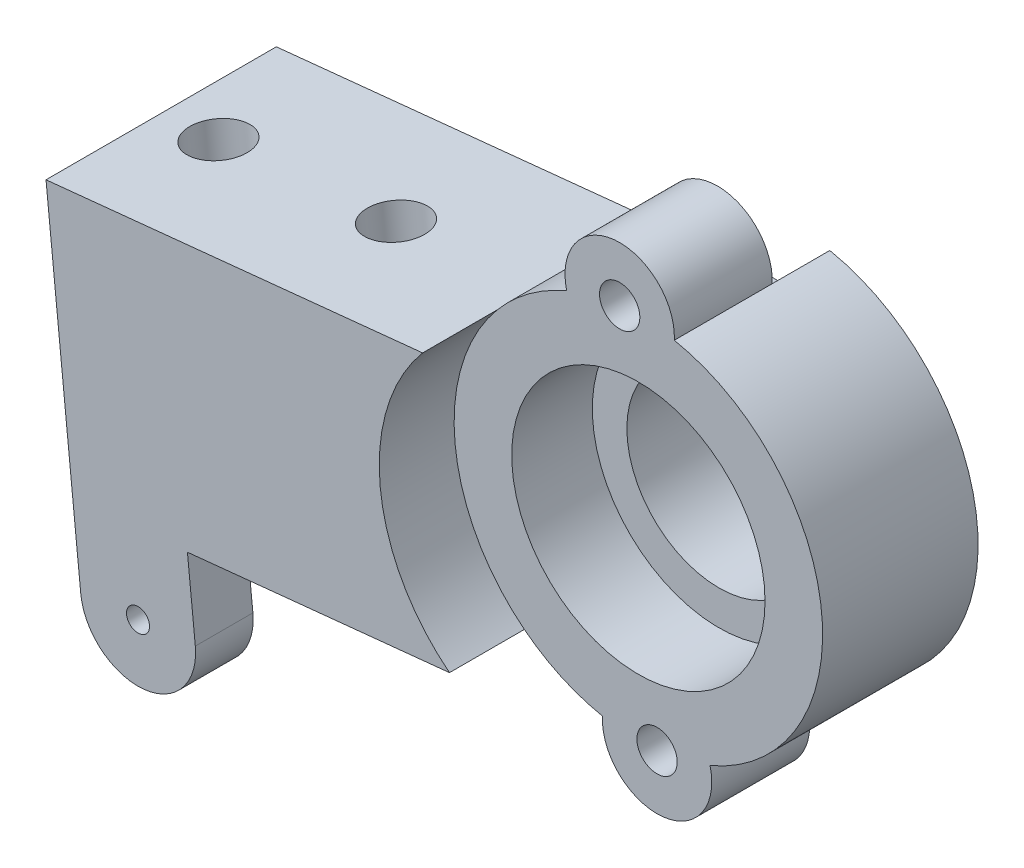
ISO-10303-21;
HEADER;
FILE_DESCRIPTION(('STEP AP214'),'2;1');
FILE_NAME('part.step','',(''),(''),'','','');
FILE_SCHEMA(('AUTOMOTIVE_DESIGN { 1 0 10303 214 1 1 1 1 }'));
ENDSEC;
DATA;
#1=APPLICATION_CONTEXT('core data for automotive mechanical design processes');
#2=APPLICATION_PROTOCOL_DEFINITION('international standard','automotive_design',2000,#1);
#3=PRODUCT_CONTEXT('',#1,'mechanical');
#4=PRODUCT('Part','Part','',(#3));
#5=PRODUCT_RELATED_PRODUCT_CATEGORY('part','',(#4));
#6=PRODUCT_DEFINITION_FORMATION('','',#4);
#7=PRODUCT_DEFINITION_CONTEXT('part definition',#1,'design');
#8=PRODUCT_DEFINITION('design','',#6,#7);
#9=PRODUCT_DEFINITION_SHAPE('','',#8);
#10=(LENGTH_UNIT() NAMED_UNIT(*) SI_UNIT(.MILLI.,.METRE.));
#11=(NAMED_UNIT(*) PLANE_ANGLE_UNIT() SI_UNIT($,.RADIAN.));
#12=(NAMED_UNIT(*) SI_UNIT($,.STERADIAN.) SOLID_ANGLE_UNIT());
#13=UNCERTAINTY_MEASURE_WITH_UNIT(LENGTH_MEASURE(1.E-05),#10,'distance_accuracy_value','');
#14=(GEOMETRIC_REPRESENTATION_CONTEXT(3) GLOBAL_UNCERTAINTY_ASSIGNED_CONTEXT((#13)) GLOBAL_UNIT_ASSIGNED_CONTEXT((#10,
#11,#12)) REPRESENTATION_CONTEXT('',''));
#15=CARTESIAN_POINT('',(0.,0.,0.));
#16=DIRECTION('',(0.,0.,1.));
#17=DIRECTION('',(1.,0.,0.));
#18=AXIS2_PLACEMENT_3D('',#15,#16,#17);
#19=CARTESIAN_POINT('',(1.6225111963711,-15.9175204544442,-11.4497474683058));
#20=DIRECTION('',(0.,0.,1.));
#21=DIRECTION('',(1.,0.,0.));
#22=AXIS2_PLACEMENT_3D('',#19,#20,#21);
#23=CYLINDRICAL_SURFACE('',#22,1.75);
#24=CARTESIAN_POINT('',(1.6225111963711,-15.9175204544442,7.));
#25=DIRECTION('',(0.,0.,1.));
#26=DIRECTION('',(1.,0.,0.));
#27=AXIS2_PLACEMENT_3D('',#24,#25,#26);
#28=CIRCLE('',#27,1.75);
#29=CARTESIAN_POINT('',(3.3725111963711,-15.9175204544442,7.));
#30=VERTEX_POINT('',#29);
#31=EDGE_CURVE('E403',#30,#30,#28,.T.);
#32=ORIENTED_EDGE('',*,*,#31,.T.);
#33=EDGE_LOOP('',(#32));
#34=FACE_BOUND('',#33,.T.);
#35=CARTESIAN_POINT('',(1.6225111963711,-15.9175204544442,-1.5));
#36=DIRECTION('',(0.,0.,1.));
#37=DIRECTION('',(1.,0.,0.));
#38=AXIS2_PLACEMENT_3D('',#35,#36,#37);
#39=CIRCLE('',#38,1.75);
#40=CARTESIAN_POINT('',(3.3725111963711,-15.9175204544442,-1.5));
#41=VERTEX_POINT('',#40);
#42=EDGE_CURVE('E51',#41,#41,#39,.T.);
#43=ORIENTED_EDGE('',*,*,#42,.F.);
#44=EDGE_LOOP('',(#43));
#45=FACE_BOUND('',#44,.T.);
#46=ADVANCED_FACE('F41',(#34,#45),#23,.F.);
#47=CARTESIAN_POINT('',(-1.62251119637109,15.9175204544442,-11.4497474683058));
#48=DIRECTION('',(0.,0.,1.));
#49=DIRECTION('',(1.,0.,0.));
#50=AXIS2_PLACEMENT_3D('',#47,#48,#49);
#51=CYLINDRICAL_SURFACE('',#50,1.75);
#52=CARTESIAN_POINT('',(-1.62251119637109,15.9175204544442,7.));
#53=DIRECTION('',(0.,0.,-1.));
#54=DIRECTION('',(0.979433261075394,0.2017683996547,0.));
#55=AXIS2_PLACEMENT_3D('',#52,#53,#54);
#56=CIRCLE('',#55,1.75);
#57=CARTESIAN_POINT('',(0.0914970105108507,16.27061515384,7.));
#58=VERTEX_POINT('',#57);
#59=EDGE_CURVE('E388',#58,#58,#56,.T.);
#60=ORIENTED_EDGE('',*,*,#59,.F.);
#61=EDGE_LOOP('',(#60));
#62=FACE_BOUND('',#61,.T.);
#63=CARTESIAN_POINT('',(-1.62251119637109,15.9175204544442,-1.5));
#64=DIRECTION('',(0.,0.,1.));
#65=DIRECTION('',(1.,0.,0.));
#66=AXIS2_PLACEMENT_3D('',#63,#64,#65);
#67=CIRCLE('',#66,1.75);
#68=CARTESIAN_POINT('',(0.127488803628911,15.9175204544442,-1.5));
#69=VERTEX_POINT('',#68);
#70=EDGE_CURVE('E12',#69,#69,#67,.F.);
#71=ORIENTED_EDGE('',*,*,#70,.T.);
#72=EDGE_LOOP('',(#71));
#73=FACE_BOUND('',#72,.T.);
#74=ADVANCED_FACE('F528',(#62,#73),#51,.F.);
#75=CARTESIAN_POINT('',(0.,0.,7.));
#76=DIRECTION('',(0.,0.,-1.));
#77=DIRECTION('',(-1.,0.,0.));
#78=AXIS2_PLACEMENT_3D('',#75,#76,#77);
#79=CYLINDRICAL_SURFACE('',#78,16.);
#80=DIRECTION('',(0.,0.,1.));
#81=VECTOR('',#80,1.);
#82=CARTESIAN_POINT('',(6.22417502853785,-14.7397301608315,-17.6977094874376));
#83=LINE('',#82,#81);
#84=CARTESIAN_POINT('',(6.22417502853785,-14.7397301608315,-1.5));
#85=VERTEX_POINT('',#84);
#86=CARTESIAN_POINT('',(6.22417502853785,-14.7397301608315,7.));
#87=VERTEX_POINT('',#86);
#88=EDGE_CURVE('E413',#85,#87,#83,.T.);
#89=ORIENTED_EDGE('',*,*,#88,.F.);
#90=DIRECTION('',(0.,0.,-1.));
#91=VECTOR('',#90,1.);
#92=CARTESIAN_POINT('',(6.22417502853785,-14.7397301608315,-4.));
#93=LINE('',#92,#91);
#94=CARTESIAN_POINT('',(6.22417502853785,-14.7397301608315,-6.5));
#95=VERTEX_POINT('',#94);
#96=EDGE_CURVE('E214',#85,#95,#93,.T.);
#97=ORIENTED_EDGE('',*,*,#96,.T.);
#98=CARTESIAN_POINT('',(0.,0.,-6.5));
#99=DIRECTION('',(0.,0.,1.));
#100=DIRECTION('',(1.,0.,0.));
#101=AXIS2_PLACEMENT_3D('',#98,#99,#100);
#102=CIRCLE('',#101,16.);
#103=CARTESIAN_POINT('',(3.12215227981177,15.6924238134734,-6.5));
#104=VERTEX_POINT('',#103);
#105=EDGE_CURVE('E206',#95,#104,#102,.T.);
#106=ORIENTED_EDGE('',*,*,#105,.T.);
#107=DIRECTION('',(0.,0.,-1.));
#108=VECTOR('',#107,1.);
#109=CARTESIAN_POINT('',(3.12215227981177,15.6924238134734,-4.));
#110=LINE('',#109,#108);
#111=CARTESIAN_POINT('',(3.12215227981177,15.6924238134734,-1.5));
#112=VERTEX_POINT('',#111);
#113=EDGE_CURVE('E185',#104,#112,#110,.F.);
#114=ORIENTED_EDGE('',*,*,#113,.T.);
#115=DIRECTION('',(0.,0.,1.));
#116=VECTOR('',#115,1.);
#117=CARTESIAN_POINT('',(3.12215227981177,15.6924238134734,-17.6977094874376));
#118=LINE('',#117,#116);
#119=CARTESIAN_POINT('',(3.12215227981177,15.6924238134734,7.));
#120=VERTEX_POINT('',#119);
#121=EDGE_CURVE('E394',#112,#120,#118,.T.);
#122=ORIENTED_EDGE('',*,*,#121,.T.);
#123=CARTESIAN_POINT('',(0.,0.,7.));
#124=DIRECTION('',(0.,0.,1.));
#125=DIRECTION('',(1.,0.,0.));
#126=AXIS2_PLACEMENT_3D('',#123,#124,#125);
#127=CIRCLE('',#126,16.);
#128=EDGE_CURVE('E649',#87,#120,#127,.T.);
#129=ORIENTED_EDGE('',*,*,#128,.F.);
#130=EDGE_LOOP('',(#89,#97,#106,#114,#122,#129));
#131=FACE_BOUND('',#130,.T.);
#132=ADVANCED_FACE('F43',(#131),#79,.T.);
#133=DIRECTION('',(0.,0.,1.));
#134=VECTOR('',#133,1.);
#135=CARTESIAN_POINT('',(-6.22417502853785,14.7397301608315,-17.6977094874376));
#136=LINE('',#135,#134);
#137=CARTESIAN_POINT('',(-6.22417502853785,14.7397301608315,-1.5));
#138=VERTEX_POINT('',#137);
#139=CARTESIAN_POINT('',(-6.22417502853785,14.7397301608315,7.));
#140=VERTEX_POINT('',#139);
#141=EDGE_CURVE('E397',#138,#140,#136,.T.);
#142=ORIENTED_EDGE('',*,*,#141,.F.);
#143=DIRECTION('',(0.,0.,-1.));
#144=VECTOR('',#143,1.);
#145=CARTESIAN_POINT('',(-6.22417502853785,14.7397301608315,-4.));
#146=LINE('',#145,#144);
#147=CARTESIAN_POINT('',(-6.22417502853785,14.7397301608315,-6.5));
#148=VERTEX_POINT('',#147);
#149=EDGE_CURVE('E198',#138,#148,#146,.T.);
#150=ORIENTED_EDGE('',*,*,#149,.T.);
#151=CARTESIAN_POINT('',(-12.2331322141946,10.3126367253984,-6.5));
#152=VERTEX_POINT('',#151);
#153=EDGE_CURVE('E208',#148,#152,#102,.T.);
#154=ORIENTED_EDGE('',*,*,#153,.T.);
#155=DIRECTION('',(0.,0.,-1.));
#156=VECTOR('',#155,1.);
#157=CARTESIAN_POINT('',(-12.2331322141946,10.3126367253984,7.));
#158=LINE('',#157,#156);
#159=CARTESIAN_POINT('',(-12.2331322141946,10.3126367253984,7.));
#160=VERTEX_POINT('',#159);
#161=EDGE_CURVE('E325',#160,#152,#158,.T.);
#162=ORIENTED_EDGE('',*,*,#161,.F.);
#163=EDGE_CURVE('E313',#140,#160,#127,.T.);
#164=ORIENTED_EDGE('',*,*,#163,.F.);
#165=EDGE_LOOP('',(#142,#150,#154,#162,#164));
#166=FACE_BOUND('',#165,.T.);
#167=ADVANCED_FACE('F669',(#166),#79,.T.);
#168=CARTESIAN_POINT('',(-9.90077236941111,-12.5687989278652,-6.5));
#169=VERTEX_POINT('',#168);
#170=CARTESIAN_POINT('',(-3.12215227981177,-15.6924238134734,-6.5));
#171=VERTEX_POINT('',#170);
#172=EDGE_CURVE('E216',#169,#171,#102,.T.);
#173=ORIENTED_EDGE('',*,*,#172,.T.);
#174=DIRECTION('',(0.,0.,-1.));
#175=VECTOR('',#174,1.);
#176=CARTESIAN_POINT('',(-3.12215227981177,-15.6924238134734,-4.));
#177=LINE('',#176,#175);
#178=CARTESIAN_POINT('',(-3.12215227981177,-15.6924238134734,-1.5));
#179=VERTEX_POINT('',#178);
#180=EDGE_CURVE('E197',#171,#179,#177,.F.);
#181=ORIENTED_EDGE('',*,*,#180,.T.);
#182=DIRECTION('',(0.,0.,1.));
#183=VECTOR('',#182,1.);
#184=CARTESIAN_POINT('',(-3.12215227981177,-15.6924238134734,-17.6977094874376));
#185=LINE('',#184,#183);
#186=CARTESIAN_POINT('',(-3.12215227981177,-15.6924238134734,7.));
#187=VERTEX_POINT('',#186);
#188=EDGE_CURVE('E409',#179,#187,#185,.T.);
#189=ORIENTED_EDGE('',*,*,#188,.T.);
#190=CARTESIAN_POINT('',(-9.90077236941111,-12.5687989278652,7.));
#191=VERTEX_POINT('',#190);
#192=EDGE_CURVE('E321',#191,#187,#127,.T.);
#193=ORIENTED_EDGE('',*,*,#192,.F.);
#194=DIRECTION('',(0.,0.,-1.));
#195=VECTOR('',#194,1.);
#196=CARTESIAN_POINT('',(-9.90077236941111,-12.5687989278652,7.));
#197=LINE('',#196,#195);
#198=EDGE_CURVE('E320',#169,#191,#197,.F.);
#199=ORIENTED_EDGE('',*,*,#198,.F.);
#200=EDGE_LOOP('',(#173,#181,#189,#193,#199));
#201=FACE_BOUND('',#200,.T.);
#202=ADVANCED_FACE('F646',(#201),#79,.T.);
#203=CARTESIAN_POINT('',(-36.9479453500659,-22.1140687478084,29.7197004370489));
#204=DIRECTION('',(0.,0.,-1.));
#205=DIRECTION('',(-1.,0.,0.));
#206=AXIS2_PLACEMENT_3D('',#203,#204,#205);
#207=CYLINDRICAL_SURFACE('',#206,5.);
#208=DIRECTION('',(0.,0.,-1.));
#209=VECTOR('',#208,1.);
#210=CARTESIAN_POINT('',(-31.973720208052,-21.6070339989425,29.7197004370489));
#211=LINE('',#210,#209);
#212=CARTESIAN_POINT('',(-31.973720208052,-21.6070339989425,-1.5));
#213=VERTEX_POINT('',#212);
#214=CARTESIAN_POINT('',(-31.973720208052,-21.6070339989425,-6.5));
#215=VERTEX_POINT('',#214);
#216=EDGE_CURVE('E476',#213,#215,#211,.T.);
#217=ORIENTED_EDGE('',*,*,#216,.F.);
#218=CARTESIAN_POINT('',(-36.9479453500659,-22.1140687478084,-1.5));
#219=DIRECTION('',(0.,0.,1.));
#220=DIRECTION('',(1.,0.,0.));
#221=AXIS2_PLACEMENT_3D('',#218,#219,#220);
#222=CIRCLE('',#221,5.);
#223=CARTESIAN_POINT('',(-41.9221704920797,-22.6211034966744,-1.5));
#224=VERTEX_POINT('',#223);
#225=EDGE_CURVE('E420',#224,#213,#222,.T.);
#226=ORIENTED_EDGE('',*,*,#225,.F.);
#227=DIRECTION('',(0.,0.,-1.));
#228=VECTOR('',#227,1.);
#229=CARTESIAN_POINT('',(-41.9221704920797,-22.6211034966744,29.7197004370489));
#230=LINE('',#229,#228);
#231=CARTESIAN_POINT('',(-41.9221704920797,-22.6211034966744,-6.5));
#232=VERTEX_POINT('',#231);
#233=EDGE_CURVE('E471',#224,#232,#230,.T.);
#234=ORIENTED_EDGE('',*,*,#233,.T.);
#235=CARTESIAN_POINT('',(-36.9479453500659,-22.1140687478084,-6.5));
#236=DIRECTION('',(0.,0.,-1.));
#237=DIRECTION('',(1.,0.,0.));
#238=AXIS2_PLACEMENT_3D('',#235,#236,#237);
#239=CIRCLE('',#238,5.);
#240=EDGE_CURVE('E451',#215,#232,#239,.T.);
#241=ORIENTED_EDGE('',*,*,#240,.F.);
#242=EDGE_LOOP('',(#217,#226,#234,#241));
#243=FACE_BOUND('',#242,.T.);
#244=ADVANCED_FACE('F567',(#243),#207,.T.);
#245=CARTESIAN_POINT('',(-32.6585510433023,-14.8885541189204,29.7197004370489));
#246=DIRECTION('',(0.994845028402765,0.101406949773193,0.));
#247=DIRECTION('',(-0.101406949773193,0.994845028402765,0.));
#248=AXIS2_PLACEMENT_3D('',#245,#246,#247);
#249=PLANE('',#248);
#250=DIRECTION('',(0.,0.,-1.));
#251=VECTOR('',#250,1.);
#252=CARTESIAN_POINT('',(-32.6585510433023,-14.8885541189204,29.7197004370489));
#253=LINE('',#252,#251);
#254=CARTESIAN_POINT('',(-32.6585510433023,-14.8885541189204,-1.5));
#255=VERTEX_POINT('',#254);
#256=CARTESIAN_POINT('',(-32.6585510433023,-14.8885541189204,-6.5));
#257=VERTEX_POINT('',#256);
#258=EDGE_CURVE('E484',#255,#257,#253,.T.);
#259=ORIENTED_EDGE('',*,*,#258,.F.);
#260=DIRECTION('',(-0.101406949773192,0.994845028402764,0.));
#261=VECTOR('',#260,1.);
#262=CARTESIAN_POINT('',(-31.973720208052,-21.6070339989425,-1.5));
#263=LINE('',#262,#261);
#264=EDGE_CURVE('E423',#213,#255,#263,.T.);
#265=ORIENTED_EDGE('',*,*,#264,.F.);
#266=ORIENTED_EDGE('',*,*,#216,.T.);
#267=DIRECTION('',(0.101406949773193,-0.994845028402764,0.));
#268=VECTOR('',#267,1.);
#269=CARTESIAN_POINT('',(-32.6585510433023,-14.8885541189204,-6.5));
#270=LINE('',#269,#268);
#271=EDGE_CURVE('E456',#257,#215,#270,.T.);
#272=ORIENTED_EDGE('',*,*,#271,.F.);
#273=EDGE_LOOP('',(#259,#265,#266,#272));
#274=FACE_BOUND('',#273,.T.);
#275=ADVANCED_FACE('F499',(#274),#249,.T.);
#276=CARTESIAN_POINT('',(-36.9479453500659,-22.1140687478084,29.7197004370489));
#277=DIRECTION('',(0.,0.,-1.));
#278=DIRECTION('',(-1.,0.,0.));
#279=AXIS2_PLACEMENT_3D('',#276,#277,#278);
#280=CYLINDRICAL_SURFACE('',#279,0.999999999999998);
#281=CARTESIAN_POINT('',(-36.9479453500659,-22.1140687478084,-6.5));
#282=DIRECTION('',(0.,0.,-1.));
#283=DIRECTION('',(-1.,0.,0.));
#284=AXIS2_PLACEMENT_3D('',#281,#282,#283);
#285=CIRCLE('',#284,0.999999999999998);
#286=CARTESIAN_POINT('',(-37.9479453500659,-22.1140687478084,-6.5));
#287=VERTEX_POINT('',#286);
#288=EDGE_CURVE('E460',#287,#287,#285,.T.);
#289=ORIENTED_EDGE('',*,*,#288,.T.);
#290=EDGE_LOOP('',(#289));
#291=FACE_BOUND('',#290,.T.);
#292=CARTESIAN_POINT('',(-36.9479453500659,-22.1140687478084,-1.5));
#293=DIRECTION('',(0.,0.,1.));
#294=DIRECTION('',(1.,0.,0.));
#295=AXIS2_PLACEMENT_3D('',#292,#293,#294);
#296=CIRCLE('',#295,0.999999999999998);
#297=CARTESIAN_POINT('',(-35.9479453500658,-22.1140687478084,-1.5));
#298=VERTEX_POINT('',#297);
#299=EDGE_CURVE('E329',#298,#298,#296,.F.);
#300=ORIENTED_EDGE('',*,*,#299,.F.);
#301=EDGE_LOOP('',(#300));
#302=FACE_BOUND('',#301,.T.);
#303=ADVANCED_FACE('F571',(#291,#302),#280,.F.);
#304=CARTESIAN_POINT('',(0.,0.,7.));
#305=DIRECTION('',(0.,0.,1.));
#306=DIRECTION('',(1.,0.,0.));
#307=AXIS2_PLACEMENT_3D('',#304,#305,#306);
#308=PLANE('',#307);
#309=ORIENTED_EDGE('',*,*,#59,.T.);
#310=EDGE_LOOP('',(#309));
#311=FACE_BOUND('',#310,.T.);
#312=ORIENTED_EDGE('',*,*,#31,.F.);
#313=EDGE_LOOP('',(#312));
#314=FACE_BOUND('',#313,.T.);
#315=EDGE_CURVE('E317',#160,#191,#127,.T.);
#316=ORIENTED_EDGE('',*,*,#315,.T.);
#317=ORIENTED_EDGE('',*,*,#192,.T.);
#318=CARTESIAN_POINT('',(1.62251119637109,-15.9175204544442,7.));
#319=DIRECTION('',(0.,0.,-1.));
#320=DIRECTION('',(-1.,0.,0.));
#321=AXIS2_PLACEMENT_3D('',#318,#319,#320);
#322=CIRCLE('',#321,4.75);
#323=EDGE_CURVE('E65',#87,#187,#322,.T.);
#324=ORIENTED_EDGE('',*,*,#323,.F.);
#325=ORIENTED_EDGE('',*,*,#128,.T.);
#326=CARTESIAN_POINT('',(-1.6225111963711,15.9175204544442,7.));
#327=DIRECTION('',(0.,0.,1.));
#328=DIRECTION('',(-0.979433261075394,-0.2017683996547,0.));
#329=AXIS2_PLACEMENT_3D('',#326,#327,#328);
#330=CIRCLE('',#329,4.75);
#331=EDGE_CURVE('E59',#120,#140,#330,.T.);
#332=ORIENTED_EDGE('',*,*,#331,.T.);
#333=ORIENTED_EDGE('',*,*,#163,.T.);
#334=EDGE_LOOP('',(#316,#317,#324,#325,#332,#333));
#335=FACE_BOUND('',#334,.T.);
#336=CARTESIAN_POINT('',(0.,0.,7.));
#337=DIRECTION('',(0.,0.,1.));
#338=DIRECTION('',(1.,0.,0.));
#339=AXIS2_PLACEMENT_3D('',#336,#337,#338);
#340=CIRCLE('',#339,11.);
#341=CARTESIAN_POINT('',(11.,0.,7.));
#342=VERTEX_POINT('',#341);
#343=EDGE_CURVE('E309',#342,#342,#340,.T.);
#344=ORIENTED_EDGE('',*,*,#343,.F.);
#345=EDGE_LOOP('',(#344));
#346=FACE_BOUND('',#345,.T.);
#347=ADVANCED_FACE('F620',(#311,#314,#335,#346),#308,.T.);
#348=CARTESIAN_POINT('',(0.,0.,7.));
#349=DIRECTION('',(0.,0.,-1.));
#350=DIRECTION('',(-1.,0.,0.));
#351=AXIS2_PLACEMENT_3D('',#348,#349,#350);
#352=CYLINDRICAL_SURFACE('',#351,11.);
#353=ORIENTED_EDGE('',*,*,#343,.T.);
#354=EDGE_LOOP('',(#353));
#355=FACE_BOUND('',#354,.T.);
#356=CARTESIAN_POINT('',(0.,0.,0.));
#357=DIRECTION('',(0.,0.,1.));
#358=DIRECTION('',(1.,0.,0.));
#359=AXIS2_PLACEMENT_3D('',#356,#357,#358);
#360=CIRCLE('',#359,11.);
#361=CARTESIAN_POINT('',(11.,0.,0.));
#362=VERTEX_POINT('',#361);
#363=EDGE_CURVE('E308',#362,#362,#360,.T.);
#364=ORIENTED_EDGE('',*,*,#363,.F.);
#365=EDGE_LOOP('',(#364));
#366=FACE_BOUND('',#365,.T.);
#367=ADVANCED_FACE('F617',(#355,#366),#352,.F.);
#368=CARTESIAN_POINT('',(1.02348685082632E-13,0.,13.5));
#369=DIRECTION('',(0.,0.,-1.));
#370=DIRECTION('',(-1.,0.,0.));
#371=AXIS2_PLACEMENT_3D('',#368,#369,#370);
#372=CYLINDRICAL_SURFACE('',#371,16.0000000000001);
#373=ORIENTED_EDGE('',*,*,#315,.F.);
#374=DIRECTION('',(0.,0.,-1.));
#375=VECTOR('',#374,1.);
#376=CARTESIAN_POINT('',(-12.2331322141946,10.3126367253984,13.5));
#377=LINE('',#376,#375);
#378=CARTESIAN_POINT('',(-12.2331322141946,10.3126367253984,13.5));
#379=VERTEX_POINT('',#378);
#380=EDGE_CURVE('E304',#379,#160,#377,.T.);
#381=ORIENTED_EDGE('',*,*,#380,.F.);
#382=CARTESIAN_POINT('',(1.02348685082632E-13,0.,13.5));
#383=DIRECTION('',(0.,0.,-1.));
#384=DIRECTION('',(1.,0.,0.));
#385=AXIS2_PLACEMENT_3D('',#382,#383,#384);
#386=CIRCLE('',#385,16.0000000000001);
#387=CARTESIAN_POINT('',(-9.90077236941111,-12.5687989278652,13.5));
#388=VERTEX_POINT('',#387);
#389=EDGE_CURVE('E284',#388,#379,#386,.T.);
#390=ORIENTED_EDGE('',*,*,#389,.F.);
#391=DIRECTION('',(0.,0.,-1.));
#392=VECTOR('',#391,1.);
#393=CARTESIAN_POINT('',(-9.90077236941111,-12.5687989278652,13.5));
#394=LINE('',#393,#392);
#395=EDGE_CURVE('E297',#388,#191,#394,.T.);
#396=ORIENTED_EDGE('',*,*,#395,.T.);
#397=EDGE_LOOP('',(#373,#381,#390,#396));
#398=FACE_BOUND('',#397,.T.);
#399=ADVANCED_FACE('F613',(#398),#372,.F.);
#400=CARTESIAN_POINT('',(-12.2331322141946,10.3126367253984,13.5));
#401=DIRECTION('',(0.101406949773193,-0.994845028402764,0.));
#402=DIRECTION('',(0.994845028402764,0.101406949773193,0.));
#403=AXIS2_PLACEMENT_3D('',#400,#401,#402);
#404=PLANE('',#403);
#405=CARTESIAN_POINT('',(-39.9651360300997,7.48584678547724,3.50000000000014));
#406=DIRECTION('',(0.101406949773193,-0.994845028402764,0.));
#407=DIRECTION('',(0.994845028402764,0.101406949773193,0.));
#408=AXIS2_PLACEMENT_3D('',#405,#406,#407);
#409=CIRCLE('',#408,2.5);
#410=CARTESIAN_POINT('',(-37.4780234590927,7.73936415991022,3.50000000000014));
#411=VERTEX_POINT('',#410);
#412=EDGE_CURVE('E345',#411,#411,#409,.F.);
#413=ORIENTED_EDGE('',*,*,#412,.F.);
#414=EDGE_LOOP('',(#413));
#415=FACE_BOUND('',#414,.T.);
#416=CARTESIAN_POINT('',(-24.5450380898568,9.05765450696173,3.50000000000014));
#417=DIRECTION('',(0.101406949773193,-0.994845028402764,0.));
#418=DIRECTION('',(0.994845028402764,0.101406949773193,0.));
#419=AXIS2_PLACEMENT_3D('',#416,#417,#418);
#420=CIRCLE('',#419,2.5);
#421=CARTESIAN_POINT('',(-22.0579255188499,9.31117188139471,3.50000000000014));
#422=VERTEX_POINT('',#421);
#423=EDGE_CURVE('E359',#422,#422,#420,.F.);
#424=ORIENTED_EDGE('',*,*,#423,.F.);
#425=EDGE_LOOP('',(#424));
#426=FACE_BOUND('',#425,.T.);
#427=ORIENTED_EDGE('',*,*,#380,.T.);
#428=ORIENTED_EDGE('',*,*,#161,.T.);
#429=DIRECTION('',(-0.994845028402764,-0.101406949773193,0.));
#430=VECTOR('',#429,1.);
#431=CARTESIAN_POINT('',(-12.2331322141946,10.3126367253984,-6.5));
#432=LINE('',#431,#430);
#433=CARTESIAN_POINT('',(-44.9393611721134,6.97881203661128,-6.5));
#434=VERTEX_POINT('',#433);
#435=EDGE_CURVE('E264',#152,#434,#432,.T.);
#436=ORIENTED_EDGE('',*,*,#435,.T.);
#437=DIRECTION('',(0.,0.,-1.));
#438=VECTOR('',#437,1.);
#439=CARTESIAN_POINT('',(-44.9393611721134,6.97881203661128,13.5));
#440=LINE('',#439,#438);
#441=CARTESIAN_POINT('',(-44.9393611721134,6.97881203661128,13.5));
#442=VERTEX_POINT('',#441);
#443=EDGE_CURVE('E301',#442,#434,#440,.T.);
#444=ORIENTED_EDGE('',*,*,#443,.F.);
#445=DIRECTION('',(-0.994845028402764,-0.101406949773193,0.));
#446=VECTOR('',#445,1.);
#447=CARTESIAN_POINT('',(-12.2331322141946,10.3126367253984,13.5));
#448=LINE('',#447,#446);
#449=EDGE_CURVE('E288',#379,#442,#448,.T.);
#450=ORIENTED_EDGE('',*,*,#449,.F.);
#451=EDGE_LOOP('',(#427,#428,#436,#444,#450));
#452=FACE_BOUND('',#451,.T.);
#453=ADVANCED_FACE('F609',(#415,#426,#452),#404,.F.);
#454=CARTESIAN_POINT('',(-44.9393611721134,6.97881203661128,13.5));
#455=DIRECTION('',(0.994845028402764,0.101406949773193,0.));
#456=DIRECTION('',(-0.101406949773193,0.994845028402764,0.));
#457=AXIS2_PLACEMENT_3D('',#454,#455,#456);
#458=PLANE('',#457);
#459=DIRECTION('',(0.,0.,1.));
#460=VECTOR('',#459,1.);
#461=CARTESIAN_POINT('',(-43.1140360761959,-10.9283984746385,10.));
#462=LINE('',#461,#460);
#463=CARTESIAN_POINT('',(-43.1140360761959,-10.9283984746385,-3.));
#464=VERTEX_POINT('',#463);
#465=CARTESIAN_POINT('',(-43.1140360761959,-10.9283984746385,10.));
#466=VERTEX_POINT('',#465);
#467=EDGE_CURVE('E250',#464,#466,#462,.T.);
#468=ORIENTED_EDGE('',*,*,#467,.F.);
#469=DIRECTION('',(0.101406949773193,-0.994845028402764,0.));
#470=VECTOR('',#469,1.);
#471=CARTESIAN_POINT('',(-44.4323264232474,2.00458689459746,-3.));
#472=LINE('',#471,#470);
#473=CARTESIAN_POINT('',(-44.4323264232474,2.00458689459746,-3.));
#474=VERTEX_POINT('',#473);
#475=EDGE_CURVE('E229',#474,#464,#472,.T.);
#476=ORIENTED_EDGE('',*,*,#475,.F.);
#477=DIRECTION('',(0.,0.,-1.));
#478=VECTOR('',#477,1.);
#479=CARTESIAN_POINT('',(-44.4323264232474,2.00458689459746,10.));
#480=LINE('',#479,#478);
#481=CARTESIAN_POINT('',(-44.4323264232474,2.00458689459746,10.));
#482=VERTEX_POINT('',#481);
#483=EDGE_CURVE('E235',#482,#474,#480,.T.);
#484=ORIENTED_EDGE('',*,*,#483,.F.);
#485=DIRECTION('',(-0.101406949773193,0.994845028402764,0.));
#486=VECTOR('',#485,1.);
#487=CARTESIAN_POINT('',(-44.4323264232474,2.00458689459746,10.));
#488=LINE('',#487,#486);
#489=EDGE_CURVE('E254',#466,#482,#488,.T.);
#490=ORIENTED_EDGE('',*,*,#489,.F.);
#491=EDGE_LOOP('',(#468,#476,#484,#490));
#492=FACE_BOUND('',#491,.T.);
#493=DIRECTION('',(0.,0.,-1.));
#494=VECTOR('',#493,1.);
#495=CARTESIAN_POINT('',(-42.6070013273299,-15.9026236166523,8.5));
#496=LINE('',#495,#494);
#497=CARTESIAN_POINT('',(-42.6070013273299,-15.9026236166523,8.5));
#498=VERTEX_POINT('',#497);
#499=CARTESIAN_POINT('',(-42.6070013273299,-15.9026236166523,-1.5));
#500=VERTEX_POINT('',#499);
#501=EDGE_CURVE('E334',#498,#500,#496,.T.);
#502=ORIENTED_EDGE('',*,*,#501,.F.);
#503=DIRECTION('',(0.101406949773193,-0.994845028402764,0.));
#504=VECTOR('',#503,1.);
#505=CARTESIAN_POINT('',(-42.6070013273299,-15.9026236166523,8.5));
#506=LINE('',#505,#504);
#507=CARTESIAN_POINT('',(-41.9221704920797,-22.6211034966744,8.5));
#508=VERTEX_POINT('',#507);
#509=EDGE_CURVE('E445',#498,#508,#506,.T.);
#510=ORIENTED_EDGE('',*,*,#509,.T.);
#511=CARTESIAN_POINT('',(-41.9221704920797,-22.6211034966744,13.5));
#512=VERTEX_POINT('',#511);
#513=EDGE_CURVE('E477',#512,#508,#230,.T.);
#514=ORIENTED_EDGE('',*,*,#513,.F.);
#515=DIRECTION('',(0.101406949773193,-0.994845028402764,0.));
#516=VECTOR('',#515,1.);
#517=CARTESIAN_POINT('',(-44.9393611721134,6.97881203661128,13.5));
#518=LINE('',#517,#516);
#519=EDGE_CURVE('E291',#442,#512,#518,.T.);
#520=ORIENTED_EDGE('',*,*,#519,.F.);
#521=ORIENTED_EDGE('',*,*,#443,.T.);
#522=DIRECTION('',(0.101406949773193,-0.994845028402764,0.));
#523=VECTOR('',#522,1.);
#524=CARTESIAN_POINT('',(-44.9393611721134,6.97881203661128,-6.5));
#525=LINE('',#524,#523);
#526=EDGE_CURVE('E277',#434,#232,#525,.T.);
#527=ORIENTED_EDGE('',*,*,#526,.T.);
#528=ORIENTED_EDGE('',*,*,#233,.F.);
#529=DIRECTION('',(0.101406949773193,-0.994845028402764,0.));
#530=VECTOR('',#529,1.);
#531=CARTESIAN_POINT('',(-42.6070013273299,-15.9026236166523,-1.5));
#532=LINE('',#531,#530);
#533=EDGE_CURVE('E431',#500,#224,#532,.T.);
#534=ORIENTED_EDGE('',*,*,#533,.F.);
#535=EDGE_LOOP('',(#502,#510,#514,#520,#521,#527,#528,#534));
#536=FACE_BOUND('',#535,.T.);
#537=ADVANCED_FACE('F605',(#492,#536),#458,.F.);
#538=CARTESIAN_POINT('',(-42.6070013273299,-15.9026236166523,13.5));
#539=DIRECTION('',(-0.101406949773193,0.994845028402764,0.));
#540=DIRECTION('',(-0.994845028402764,-0.101406949773193,0.));
#541=AXIS2_PLACEMENT_3D('',#538,#539,#540);
#542=PLANE('',#541);
#543=CARTESIAN_POINT('',(-37.6327761853162,-15.3955888677863,3.50000000000014));
#544=DIRECTION('',(0.101406949773193,-0.994845028402764,0.));
#545=DIRECTION('',(0.994845028402764,0.101406949773193,0.));
#546=AXIS2_PLACEMENT_3D('',#543,#544,#545);
#547=CIRCLE('',#546,2.5);
#548=CARTESIAN_POINT('',(-35.1456636143093,-15.1420714933534,3.50000000000014));
#549=VERTEX_POINT('',#548);
#550=EDGE_CURVE('E353',#549,#549,#547,.T.);
#551=ORIENTED_EDGE('',*,*,#550,.F.);
#552=EDGE_LOOP('',(#551));
#553=FACE_BOUND('',#552,.T.);
#554=CARTESIAN_POINT('',(-22.2126782450734,-13.8237811463019,3.50000000000014));
#555=DIRECTION('',(0.101406949773193,-0.994845028402764,0.));
#556=DIRECTION('',(0.994845028402764,0.101406949773193,0.));
#557=AXIS2_PLACEMENT_3D('',#554,#555,#556);
#558=CIRCLE('',#557,2.5);
#559=CARTESIAN_POINT('',(-19.7255656740665,-13.5702637718689,3.50000000000014));
#560=VERTEX_POINT('',#559);
#561=EDGE_CURVE('E362',#560,#560,#558,.T.);
#562=ORIENTED_EDGE('',*,*,#561,.F.);
#563=EDGE_LOOP('',(#562));
#564=FACE_BOUND('',#563,.T.);
#565=DIRECTION('',(0.994845028402764,0.101406949773193,0.));
#566=VECTOR('',#565,1.);
#567=CARTESIAN_POINT('',(-42.6070013273299,-15.9026236166523,13.5));
#568=LINE('',#567,#566);
#569=CARTESIAN_POINT('',(-32.6585510433023,-14.8885541189204,13.5));
#570=VERTEX_POINT('',#569);
#571=EDGE_CURVE('E294',#570,#388,#568,.T.);
#572=ORIENTED_EDGE('',*,*,#571,.F.);
#573=CARTESIAN_POINT('',(-32.6585510433023,-14.8885541189204,8.5));
#574=VERTEX_POINT('',#573);
#575=EDGE_CURVE('E464',#570,#574,#253,.T.);
#576=ORIENTED_EDGE('',*,*,#575,.T.);
#577=DIRECTION('',(-0.994845028402764,-0.101406949773193,0.));
#578=VECTOR('',#577,1.);
#579=CARTESIAN_POINT('',(-32.6585510433023,-14.8885541189204,8.5));
#580=LINE('',#579,#578);
#581=EDGE_CURVE('E442',#574,#498,#580,.T.);
#582=ORIENTED_EDGE('',*,*,#581,.T.);
#583=ORIENTED_EDGE('',*,*,#501,.T.);
#584=DIRECTION('',(-0.994845028402764,-0.101406949773193,0.));
#585=VECTOR('',#584,1.);
#586=CARTESIAN_POINT('',(-32.6585510433023,-14.8885541189204,-1.5));
#587=LINE('',#586,#585);
#588=EDGE_CURVE('E427',#255,#500,#587,.T.);
#589=ORIENTED_EDGE('',*,*,#588,.F.);
#590=ORIENTED_EDGE('',*,*,#258,.T.);
#591=DIRECTION('',(0.994845028402764,0.101406949773193,0.));
#592=VECTOR('',#591,1.);
#593=CARTESIAN_POINT('',(-42.6070013273299,-15.9026236166523,-6.5));
#594=LINE('',#593,#592);
#595=EDGE_CURVE('E281',#257,#169,#594,.T.);
#596=ORIENTED_EDGE('',*,*,#595,.T.);
#597=ORIENTED_EDGE('',*,*,#198,.T.);
#598=ORIENTED_EDGE('',*,*,#395,.F.);
#599=EDGE_LOOP('',(#572,#576,#582,#583,#589,#590,#596,#597,#598));
#600=FACE_BOUND('',#599,.T.);
#601=ADVANCED_FACE('F492',(#553,#564,#600),#542,.F.);
#602=CARTESIAN_POINT('',(1.02348685082632E-13,0.,13.5));
#603=DIRECTION('',(0.,0.,1.));
#604=DIRECTION('',(1.,0.,0.));
#605=AXIS2_PLACEMENT_3D('',#602,#603,#604);
#606=PLANE('',#605);
#607=ORIENTED_EDGE('',*,*,#389,.T.);
#608=ORIENTED_EDGE('',*,*,#449,.T.);
#609=ORIENTED_EDGE('',*,*,#519,.T.);
#610=CARTESIAN_POINT('',(-36.9479453500659,-22.1140687478084,13.5));
#611=DIRECTION('',(0.,0.,1.));
#612=DIRECTION('',(1.,0.,0.));
#613=AXIS2_PLACEMENT_3D('',#610,#611,#612);
#614=CIRCLE('',#613,5.);
#615=CARTESIAN_POINT('',(-31.973720208052,-21.6070339989425,13.5));
#616=VERTEX_POINT('',#615);
#617=EDGE_CURVE('E338',#616,#512,#614,.F.);
#618=ORIENTED_EDGE('',*,*,#617,.F.);
#619=DIRECTION('',(0.101406949773193,-0.994845028402765,0.));
#620=VECTOR('',#619,1.);
#621=CARTESIAN_POINT('',(-32.6585510433023,-14.8885541189204,13.5));
#622=LINE('',#621,#620);
#623=EDGE_CURVE('E472',#570,#616,#622,.T.);
#624=ORIENTED_EDGE('',*,*,#623,.F.);
#625=ORIENTED_EDGE('',*,*,#571,.T.);
#626=EDGE_LOOP('',(#607,#608,#609,#618,#624,#625));
#627=FACE_BOUND('',#626,.T.);
#628=CARTESIAN_POINT('',(-36.9479453500659,-22.1140687478084,13.5));
#629=DIRECTION('',(0.,0.,1.));
#630=DIRECTION('',(1.,0.,0.));
#631=AXIS2_PLACEMENT_3D('',#628,#629,#630);
#632=CIRCLE('',#631,0.999999999999998);
#633=CARTESIAN_POINT('',(-35.9479453500658,-22.1140687478084,13.5));
#634=VERTEX_POINT('',#633);
#635=EDGE_CURVE('E455',#634,#634,#632,.F.);
#636=ORIENTED_EDGE('',*,*,#635,.T.);
#637=EDGE_LOOP('',(#636));
#638=FACE_BOUND('',#637,.T.);
#639=ADVANCED_FACE('F599',(#627,#638),#606,.T.);
#640=CARTESIAN_POINT('',(1.02348685082632E-13,0.,-6.5));
#641=DIRECTION('',(0.,0.,1.));
#642=DIRECTION('',(1.,0.,0.));
#643=AXIS2_PLACEMENT_3D('',#640,#641,#642);
#644=PLANE('',#643);
#645=ORIENTED_EDGE('',*,*,#105,.F.);
#646=CARTESIAN_POINT('',(1.6225111963711,-15.9175204544442,-6.5));
#647=DIRECTION('',(0.,0.,-1.));
#648=DIRECTION('',(-1.,0.,0.));
#649=AXIS2_PLACEMENT_3D('',#646,#647,#648);
#650=CIRCLE('',#649,4.75);
#651=EDGE_CURVE('E376',#171,#95,#650,.T.);
#652=ORIENTED_EDGE('',*,*,#651,.F.);
#653=ORIENTED_EDGE('',*,*,#172,.F.);
#654=ORIENTED_EDGE('',*,*,#595,.F.);
#655=ORIENTED_EDGE('',*,*,#271,.T.);
#656=ORIENTED_EDGE('',*,*,#240,.T.);
#657=ORIENTED_EDGE('',*,*,#526,.F.);
#658=ORIENTED_EDGE('',*,*,#435,.F.);
#659=ORIENTED_EDGE('',*,*,#153,.F.);
#660=CARTESIAN_POINT('',(-1.62251119637109,15.9175204544442,-6.5));
#661=DIRECTION('',(0.,0.,-1.));
#662=DIRECTION('',(-1.,0.,0.));
#663=AXIS2_PLACEMENT_3D('',#660,#661,#662);
#664=CIRCLE('',#663,4.75);
#665=EDGE_CURVE('E188',#104,#148,#664,.T.);
#666=ORIENTED_EDGE('',*,*,#665,.F.);
#667=EDGE_LOOP('',(#645,#652,#653,#654,#655,#656,#657,#658,#659,#666));
#668=FACE_BOUND('',#667,.T.);
#669=CARTESIAN_POINT('',(0.,0.,-6.5));
#670=DIRECTION('',(0.,0.,1.));
#671=DIRECTION('',(1.,0.,0.));
#672=AXIS2_PLACEMENT_3D('',#669,#670,#671);
#673=CIRCLE('',#672,8.);
#674=CARTESIAN_POINT('',(8.,0.,-6.5));
#675=VERTEX_POINT('',#674);
#676=EDGE_CURVE('E221',#675,#675,#673,.T.);
#677=ORIENTED_EDGE('',*,*,#676,.T.);
#678=EDGE_LOOP('',(#677));
#679=FACE_BOUND('',#678,.T.);
#680=ORIENTED_EDGE('',*,*,#288,.F.);
#681=EDGE_LOOP('',(#680));
#682=FACE_BOUND('',#681,.T.);
#683=ADVANCED_FACE('F203',(#668,#679,#682),#644,.F.);
#684=CARTESIAN_POINT('',(-18.5663556847755,4.64116758870049,-3.));
#685=DIRECTION('',(0.,0.,-1.));
#686=DIRECTION('',(0.,1.,0.));
#687=AXIS2_PLACEMENT_3D('',#684,#685,#686);
#688=PLANE('',#687);
#689=ORIENTED_EDGE('',*,*,#475,.T.);
#690=DIRECTION('',(-0.994845028402764,-0.101406949773193,0.));
#691=VECTOR('',#690,1.);
#692=CARTESIAN_POINT('',(-17.248065337724,-8.29181778053545,-3.));
#693=LINE('',#692,#691);
#694=CARTESIAN_POINT('',(-17.248065337724,-8.29181778053545,-3.));
#695=VERTEX_POINT('',#694);
#696=EDGE_CURVE('E247',#695,#464,#693,.T.);
#697=ORIENTED_EDGE('',*,*,#696,.F.);
#698=DIRECTION('',(0.101406949773193,-0.994845028402764,0.));
#699=VECTOR('',#698,1.);
#700=CARTESIAN_POINT('',(-18.5663556847755,4.64116758870049,-3.));
#701=LINE('',#700,#699);
#702=CARTESIAN_POINT('',(-18.5663556847755,4.64116758870049,-3.));
#703=VERTEX_POINT('',#702);
#704=EDGE_CURVE('E230',#703,#695,#701,.T.);
#705=ORIENTED_EDGE('',*,*,#704,.F.);
#706=DIRECTION('',(-0.994845028402764,-0.101406949773193,0.));
#707=VECTOR('',#706,1.);
#708=CARTESIAN_POINT('',(-18.5663556847755,4.64116758870049,-3.));
#709=LINE('',#708,#707);
#710=EDGE_CURVE('E261',#703,#474,#709,.T.);
#711=ORIENTED_EDGE('',*,*,#710,.T.);
#712=EDGE_LOOP('',(#689,#697,#705,#711));
#713=FACE_BOUND('',#712,.T.);
#714=ADVANCED_FACE('F587',(#713),#688,.F.);
#715=CARTESIAN_POINT('',(-18.5663556847755,4.64116758870049,10.));
#716=DIRECTION('',(-0.101406949773193,0.994845028402764,0.));
#717=DIRECTION('',(-0.994845028402764,-0.101406949773193,0.));
#718=AXIS2_PLACEMENT_3D('',#715,#716,#717);
#719=PLANE('',#718);
#720=CARTESIAN_POINT('',(-39.4581012812337,2.51162164346341,3.50000000000014));
#721=DIRECTION('',(-0.101406949773193,0.994845028402764,0.));
#722=DIRECTION('',(-0.994845028402764,-0.101406949773193,0.));
#723=AXIS2_PLACEMENT_3D('',#720,#721,#722);
#724=CIRCLE('',#723,2.5);
#725=CARTESIAN_POINT('',(-41.9452138522406,2.25810426903043,3.50000000000014));
#726=VERTEX_POINT('',#725);
#727=EDGE_CURVE('E210',#726,#726,#724,.T.);
#728=ORIENTED_EDGE('',*,*,#727,.T.);
#729=EDGE_LOOP('',(#728));
#730=FACE_BOUND('',#729,.T.);
#731=CARTESIAN_POINT('',(-24.0380033409909,4.08342936494791,3.50000000000014));
#732=DIRECTION('',(-0.101406949773193,0.994845028402764,0.));
#733=DIRECTION('',(-0.994845028402764,-0.101406949773193,0.));
#734=AXIS2_PLACEMENT_3D('',#731,#732,#733);
#735=CIRCLE('',#734,2.5);
#736=CARTESIAN_POINT('',(-26.5251159119978,3.82991199051493,3.50000000000014));
#737=VERTEX_POINT('',#736);
#738=EDGE_CURVE('E344',#737,#737,#735,.T.);
#739=ORIENTED_EDGE('',*,*,#738,.T.);
#740=EDGE_LOOP('',(#739));
#741=FACE_BOUND('',#740,.T.);
#742=ORIENTED_EDGE('',*,*,#483,.T.);
#743=ORIENTED_EDGE('',*,*,#710,.F.);
#744=DIRECTION('',(0.,0.,-1.));
#745=VECTOR('',#744,1.);
#746=CARTESIAN_POINT('',(-18.5663556847755,4.64116758870049,10.));
#747=LINE('',#746,#745);
#748=CARTESIAN_POINT('',(-18.5663556847755,4.64116758870049,10.));
#749=VERTEX_POINT('',#748);
#750=EDGE_CURVE('E243',#749,#703,#747,.T.);
#751=ORIENTED_EDGE('',*,*,#750,.F.);
#752=DIRECTION('',(-0.994845028402764,-0.101406949773193,0.));
#753=VECTOR('',#752,1.);
#754=CARTESIAN_POINT('',(-18.5663556847755,4.64116758870049,10.));
#755=LINE('',#754,#753);
#756=EDGE_CURVE('E265',#749,#482,#755,.T.);
#757=ORIENTED_EDGE('',*,*,#756,.T.);
#758=EDGE_LOOP('',(#742,#743,#751,#757));
#759=FACE_BOUND('',#758,.T.);
#760=ADVANCED_FACE('F583',(#730,#741,#759),#719,.F.);
#761=CARTESIAN_POINT('',(-18.5663556847755,4.64116758870049,10.));
#762=DIRECTION('',(0.,0.,1.));
#763=DIRECTION('',(0.,-1.,0.));
#764=AXIS2_PLACEMENT_3D('',#761,#762,#763);
#765=PLANE('',#764);
#766=ORIENTED_EDGE('',*,*,#489,.T.);
#767=ORIENTED_EDGE('',*,*,#756,.F.);
#768=DIRECTION('',(-0.101406949773193,0.994845028402764,0.));
#769=VECTOR('',#768,1.);
#770=CARTESIAN_POINT('',(-18.5663556847755,4.64116758870049,10.));
#771=LINE('',#770,#769);
#772=CARTESIAN_POINT('',(-17.248065337724,-8.29181778053545,10.));
#773=VERTEX_POINT('',#772);
#774=EDGE_CURVE('E239',#773,#749,#771,.T.);
#775=ORIENTED_EDGE('',*,*,#774,.F.);
#776=DIRECTION('',(-0.994845028402764,-0.101406949773193,0.));
#777=VECTOR('',#776,1.);
#778=CARTESIAN_POINT('',(-17.248065337724,-8.29181778053545,10.));
#779=LINE('',#778,#777);
#780=EDGE_CURVE('E268',#773,#466,#779,.T.);
#781=ORIENTED_EDGE('',*,*,#780,.T.);
#782=EDGE_LOOP('',(#766,#767,#775,#781));
#783=FACE_BOUND('',#782,.T.);
#784=ADVANCED_FACE('F586',(#783),#765,.F.);
#785=CARTESIAN_POINT('',(-17.248065337724,-8.29181778053545,10.));
#786=DIRECTION('',(0.101406949773193,-0.994845028402764,0.));
#787=DIRECTION('',(0.994845028402764,0.101406949773193,0.));
#788=AXIS2_PLACEMENT_3D('',#785,#786,#787);
#789=PLANE('',#788);
#790=CARTESIAN_POINT('',(-38.1398109341822,-10.4213637257725,3.50000000000014));
#791=DIRECTION('',(0.101406949773193,-0.994845028402764,0.));
#792=DIRECTION('',(0.994845028402764,0.101406949773193,0.));
#793=AXIS2_PLACEMENT_3D('',#790,#791,#792);
#794=CIRCLE('',#793,2.5);
#795=CARTESIAN_POINT('',(-35.6526983631753,-10.1678463513395,3.50000000000014));
#796=VERTEX_POINT('',#795);
#797=EDGE_CURVE('E45',#796,#796,#794,.T.);
#798=ORIENTED_EDGE('',*,*,#797,.T.);
#799=EDGE_LOOP('',(#798));
#800=FACE_BOUND('',#799,.T.);
#801=CARTESIAN_POINT('',(-22.7197129939393,-8.84955600428803,3.50000000000014));
#802=DIRECTION('',(0.101406949773193,-0.994845028402764,0.));
#803=DIRECTION('',(0.994845028402764,0.101406949773193,0.));
#804=AXIS2_PLACEMENT_3D('',#801,#802,#803);
#805=CIRCLE('',#804,2.5);
#806=CARTESIAN_POINT('',(-20.2326004229324,-8.59603862985505,3.50000000000014));
#807=VERTEX_POINT('',#806);
#808=EDGE_CURVE('E341',#807,#807,#805,.T.);
#809=ORIENTED_EDGE('',*,*,#808,.T.);
#810=EDGE_LOOP('',(#809));
#811=FACE_BOUND('',#810,.T.);
#812=ORIENTED_EDGE('',*,*,#467,.T.);
#813=ORIENTED_EDGE('',*,*,#780,.F.);
#814=DIRECTION('',(0.,0.,1.));
#815=VECTOR('',#814,1.);
#816=CARTESIAN_POINT('',(-17.248065337724,-8.29181778053545,10.));
#817=LINE('',#816,#815);
#818=EDGE_CURVE('E234',#695,#773,#817,.T.);
#819=ORIENTED_EDGE('',*,*,#818,.F.);
#820=ORIENTED_EDGE('',*,*,#696,.T.);
#821=EDGE_LOOP('',(#812,#813,#819,#820));
#822=FACE_BOUND('',#821,.T.);
#823=ADVANCED_FACE('F509',(#800,#811,#822),#789,.F.);
#824=CARTESIAN_POINT('',(-17.9072105112498,-1.82532509591748,0.));
#825=DIRECTION('',(0.994845028402764,0.101406949773193,0.));
#826=DIRECTION('',(-0.101406949773193,0.994845028402764,0.));
#827=AXIS2_PLACEMENT_3D('',#824,#825,#826);
#828=PLANE('',#827);
#829=ORIENTED_EDGE('',*,*,#704,.T.);
#830=ORIENTED_EDGE('',*,*,#818,.T.);
#831=ORIENTED_EDGE('',*,*,#774,.T.);
#832=ORIENTED_EDGE('',*,*,#750,.T.);
#833=EDGE_LOOP('',(#829,#830,#831,#832));
#834=FACE_BOUND('',#833,.T.);
#835=ADVANCED_FACE('F575',(#834),#828,.F.);
#836=CARTESIAN_POINT('',(0.,0.,0.));
#837=DIRECTION('',(0.,0.,-1.));
#838=DIRECTION('',(-1.,0.,0.));
#839=AXIS2_PLACEMENT_3D('',#836,#837,#838);
#840=PLANE('',#839);
#841=ORIENTED_EDGE('',*,*,#363,.T.);
#842=EDGE_LOOP('',(#841));
#843=FACE_BOUND('',#842,.T.);
#844=CARTESIAN_POINT('',(0.,0.,0.));
#845=DIRECTION('',(0.,0.,-1.));
#846=DIRECTION('',(-1.,0.,0.));
#847=AXIS2_PLACEMENT_3D('',#844,#845,#846);
#848=CIRCLE('',#847,8.);
#849=CARTESIAN_POINT('',(-8.,0.,0.));
#850=VERTEX_POINT('',#849);
#851=EDGE_CURVE('E222',#850,#850,#848,.T.);
#852=ORIENTED_EDGE('',*,*,#851,.T.);
#853=EDGE_LOOP('',(#852));
#854=FACE_BOUND('',#853,.T.);
#855=ADVANCED_FACE('F572',(#843,#854),#840,.F.);
#856=CARTESIAN_POINT('',(0.,0.,-51.754833995939));
#857=DIRECTION('',(0.,0.,1.));
#858=DIRECTION('',(1.,0.,0.));
#859=AXIS2_PLACEMENT_3D('',#856,#857,#858);
#860=CYLINDRICAL_SURFACE('',#859,8.);
#861=ORIENTED_EDGE('',*,*,#676,.F.);
#862=EDGE_LOOP('',(#861));
#863=FACE_BOUND('',#862,.T.);
#864=ORIENTED_EDGE('',*,*,#851,.F.);
#865=EDGE_LOOP('',(#864));
#866=FACE_BOUND('',#865,.T.);
#867=ADVANCED_FACE('F565',(#863,#866),#860,.F.);
#868=CARTESIAN_POINT('',(-36.9479453500659,-22.1140687478084,8.5));
#869=DIRECTION('',(0.,0.,1.));
#870=DIRECTION('',(1.,0.,0.));
#871=AXIS2_PLACEMENT_3D('',#868,#869,#870);
#872=CIRCLE('',#871,5.);
#873=CARTESIAN_POINT('',(-31.973720208052,-21.6070339989425,8.5));
#874=VERTEX_POINT('',#873);
#875=EDGE_CURVE('E434',#508,#874,#872,.T.);
#876=ORIENTED_EDGE('',*,*,#875,.T.);
#877=EDGE_CURVE('E481',#616,#874,#211,.T.);
#878=ORIENTED_EDGE('',*,*,#877,.F.);
#879=ORIENTED_EDGE('',*,*,#617,.T.);
#880=ORIENTED_EDGE('',*,*,#513,.T.);
#881=EDGE_LOOP('',(#876,#878,#879,#880));
#882=FACE_BOUND('',#881,.T.);
#883=ADVANCED_FACE('F561',(#882),#207,.T.);
#884=DIRECTION('',(-0.101406949773192,0.994845028402764,0.));
#885=VECTOR('',#884,1.);
#886=CARTESIAN_POINT('',(-31.973720208052,-21.6070339989425,8.5));
#887=LINE('',#886,#885);
#888=EDGE_CURVE('E438',#874,#574,#887,.T.);
#889=ORIENTED_EDGE('',*,*,#888,.T.);
#890=ORIENTED_EDGE('',*,*,#575,.F.);
#891=ORIENTED_EDGE('',*,*,#623,.T.);
#892=ORIENTED_EDGE('',*,*,#877,.T.);
#893=EDGE_LOOP('',(#889,#890,#891,#892));
#894=FACE_BOUND('',#893,.T.);
#895=ADVANCED_FACE('F558',(#894),#249,.T.);
#896=CARTESIAN_POINT('',(-36.9479453500659,-22.1140687478084,8.5));
#897=DIRECTION('',(0.,0.,1.));
#898=DIRECTION('',(1.,0.,0.));
#899=AXIS2_PLACEMENT_3D('',#896,#897,#898);
#900=CIRCLE('',#899,0.999999999999998);
#901=CARTESIAN_POINT('',(-35.9479453500658,-22.1140687478084,8.5));
#902=VERTEX_POINT('',#901);
#903=EDGE_CURVE('E333',#902,#902,#900,.F.);
#904=ORIENTED_EDGE('',*,*,#903,.T.);
#905=EDGE_LOOP('',(#904));
#906=FACE_BOUND('',#905,.T.);
#907=ORIENTED_EDGE('',*,*,#635,.F.);
#908=EDGE_LOOP('',(#907));
#909=FACE_BOUND('',#908,.T.);
#910=ADVANCED_FACE('F556',(#906,#909),#280,.F.);
#911=CARTESIAN_POINT('',(-36.9479453500659,-22.1140687478084,8.5));
#912=DIRECTION('',(0.,0.,1.));
#913=DIRECTION('',(1.,0.,0.));
#914=AXIS2_PLACEMENT_3D('',#911,#912,#913);
#915=PLANE('',#914);
#916=ORIENTED_EDGE('',*,*,#875,.F.);
#917=ORIENTED_EDGE('',*,*,#509,.F.);
#918=ORIENTED_EDGE('',*,*,#581,.F.);
#919=ORIENTED_EDGE('',*,*,#888,.F.);
#920=EDGE_LOOP('',(#916,#917,#918,#919));
#921=FACE_BOUND('',#920,.T.);
#922=ORIENTED_EDGE('',*,*,#903,.F.);
#923=EDGE_LOOP('',(#922));
#924=FACE_BOUND('',#923,.T.);
#925=ADVANCED_FACE('F552',(#921,#924),#915,.F.);
#926=CARTESIAN_POINT('',(-36.9479453500659,-22.1140687478084,-1.5));
#927=DIRECTION('',(0.,0.,1.));
#928=DIRECTION('',(1.,0.,0.));
#929=AXIS2_PLACEMENT_3D('',#926,#927,#928);
#930=PLANE('',#929);
#931=ORIENTED_EDGE('',*,*,#225,.T.);
#932=ORIENTED_EDGE('',*,*,#264,.T.);
#933=ORIENTED_EDGE('',*,*,#588,.T.);
#934=ORIENTED_EDGE('',*,*,#533,.T.);
#935=EDGE_LOOP('',(#931,#932,#933,#934));
#936=FACE_BOUND('',#935,.T.);
#937=ORIENTED_EDGE('',*,*,#299,.T.);
#938=EDGE_LOOP('',(#937));
#939=FACE_BOUND('',#938,.T.);
#940=ADVANCED_FACE('F548',(#936,#939),#930,.T.);
#941=CARTESIAN_POINT('',(1.62251119637109,-15.9175204544442,-17.6977094874376));
#942=DIRECTION('',(0.,0.,1.));
#943=DIRECTION('',(1.,0.,0.));
#944=AXIS2_PLACEMENT_3D('',#941,#942,#943);
#945=CYLINDRICAL_SURFACE('',#944,4.75);
#946=ORIENTED_EDGE('',*,*,#188,.F.);
#947=CARTESIAN_POINT('',(1.62251119637109,-15.9175204544442,-1.5));
#948=DIRECTION('',(0.,0.,1.));
#949=DIRECTION('',(1.,0.,0.));
#950=AXIS2_PLACEMENT_3D('',#947,#948,#949);
#951=CIRCLE('',#950,4.75);
#952=EDGE_CURVE('E416',#179,#85,#951,.T.);
#953=ORIENTED_EDGE('',*,*,#952,.T.);
#954=ORIENTED_EDGE('',*,*,#88,.T.);
#955=ORIENTED_EDGE('',*,*,#323,.T.);
#956=EDGE_LOOP('',(#946,#953,#954,#955));
#957=FACE_BOUND('',#956,.T.);
#958=ADVANCED_FACE('F544',(#957),#945,.T.);
#959=CARTESIAN_POINT('',(1.02348685082632E-13,0.,-1.5));
#960=DIRECTION('',(0.,0.,1.));
#961=DIRECTION('',(1.,0.,0.));
#962=AXIS2_PLACEMENT_3D('',#959,#960,#961);
#963=PLANE('',#962);
#964=ORIENTED_EDGE('',*,*,#42,.T.);
#965=EDGE_LOOP('',(#964));
#966=FACE_BOUND('',#965,.T.);
#967=ORIENTED_EDGE('',*,*,#952,.F.);
#968=CARTESIAN_POINT('',(1.6225111963711,-15.9175204544442,-1.5));
#969=DIRECTION('',(0.,0.,-1.));
#970=DIRECTION('',(-1.,0.,0.));
#971=AXIS2_PLACEMENT_3D('',#968,#969,#970);
#972=CIRCLE('',#971,4.75);
#973=EDGE_CURVE('E372',#179,#85,#972,.T.);
#974=ORIENTED_EDGE('',*,*,#973,.T.);
#975=EDGE_LOOP('',(#967,#974));
#976=FACE_BOUND('',#975,.T.);
#977=ADVANCED_FACE('F541',(#966,#976),#963,.F.);
#978=CARTESIAN_POINT('',(-1.6225111963711,15.9175204544442,-17.6977094874376));
#979=DIRECTION('',(0.,0.,1.));
#980=DIRECTION('',(1.,0.,0.));
#981=AXIS2_PLACEMENT_3D('',#978,#979,#980);
#982=CYLINDRICAL_SURFACE('',#981,4.75);
#983=CARTESIAN_POINT('',(-1.6225111963711,15.9175204544442,-1.5));
#984=DIRECTION('',(0.,0.,1.));
#985=DIRECTION('',(1.,0.,0.));
#986=AXIS2_PLACEMENT_3D('',#983,#984,#985);
#987=CIRCLE('',#986,4.75);
#988=EDGE_CURVE('E400',#138,#112,#987,.F.);
#989=ORIENTED_EDGE('',*,*,#988,.F.);
#990=ORIENTED_EDGE('',*,*,#141,.T.);
#991=ORIENTED_EDGE('',*,*,#331,.F.);
#992=ORIENTED_EDGE('',*,*,#121,.F.);
#993=EDGE_LOOP('',(#989,#990,#991,#992));
#994=FACE_BOUND('',#993,.T.);
#995=ADVANCED_FACE('F539',(#994),#982,.T.);
#996=CARTESIAN_POINT('',(1.02348685082632E-13,0.,-1.5));
#997=DIRECTION('',(0.,0.,1.));
#998=DIRECTION('',(1.,0.,0.));
#999=AXIS2_PLACEMENT_3D('',#996,#997,#998);
#1000=PLANE('',#999);
#1001=ORIENTED_EDGE('',*,*,#70,.F.);
#1002=EDGE_LOOP('',(#1001));
#1003=FACE_BOUND('',#1002,.T.);
#1004=ORIENTED_EDGE('',*,*,#988,.T.);
#1005=CARTESIAN_POINT('',(-1.62251119637109,15.9175204544442,-1.5));
#1006=DIRECTION('',(0.,0.,-1.));
#1007=DIRECTION('',(-1.,0.,0.));
#1008=AXIS2_PLACEMENT_3D('',#1005,#1006,#1007);
#1009=CIRCLE('',#1008,4.75);
#1010=EDGE_CURVE('E191',#112,#138,#1009,.T.);
#1011=ORIENTED_EDGE('',*,*,#1010,.T.);
#1012=EDGE_LOOP('',(#1004,#1011));
#1013=FACE_BOUND('',#1012,.T.);
#1014=ADVANCED_FACE('F672',(#1003,#1013),#1000,.F.);
#1015=CARTESIAN_POINT('',(-1.62251119637109,15.9175204544442,-1.5));
#1016=DIRECTION('',(0.,0.,-1.));
#1017=DIRECTION('',(-1.,0.,0.));
#1018=AXIS2_PLACEMENT_3D('',#1015,#1016,#1017);
#1019=CYLINDRICAL_SURFACE('',#1018,4.75);
#1020=ORIENTED_EDGE('',*,*,#665,.T.);
#1021=ORIENTED_EDGE('',*,*,#149,.F.);
#1022=ORIENTED_EDGE('',*,*,#1010,.F.);
#1023=ORIENTED_EDGE('',*,*,#113,.F.);
#1024=EDGE_LOOP('',(#1020,#1021,#1022,#1023));
#1025=FACE_BOUND('',#1024,.T.);
#1026=ADVANCED_FACE('F187',(#1025),#1019,.F.);
#1027=CARTESIAN_POINT('',(1.6225111963711,-15.9175204544442,-1.5));
#1028=DIRECTION('',(0.,0.,-1.));
#1029=DIRECTION('',(-1.,0.,0.));
#1030=AXIS2_PLACEMENT_3D('',#1027,#1028,#1029);
#1031=CYLINDRICAL_SURFACE('',#1030,4.75);
#1032=ORIENTED_EDGE('',*,*,#973,.F.);
#1033=ORIENTED_EDGE('',*,*,#180,.F.);
#1034=ORIENTED_EDGE('',*,*,#651,.T.);
#1035=ORIENTED_EDGE('',*,*,#96,.F.);
#1036=EDGE_LOOP('',(#1032,#1033,#1034,#1035));
#1037=FACE_BOUND('',#1036,.T.);
#1038=ADVANCED_FACE('F524',(#1037),#1031,.F.);
#1039=CARTESIAN_POINT('',(-25.2620935082975,16.0922711650949,3.50000000000014));
#1040=DIRECTION('',(0.101406949773193,-0.994845028402764,0.));
#1041=DIRECTION('',(0.994845028402765,0.101406949773193,0.));
#1042=AXIS2_PLACEMENT_3D('',#1039,#1040,#1041);
#1043=CYLINDRICAL_SURFACE('',#1042,2.5);
#1044=ORIENTED_EDGE('',*,*,#561,.T.);
#1045=EDGE_LOOP('',(#1044));
#1046=FACE_BOUND('',#1045,.T.);
#1047=ORIENTED_EDGE('',*,*,#808,.F.);
#1048=EDGE_LOOP('',(#1047));
#1049=FACE_BOUND('',#1048,.T.);
#1050=ADVANCED_FACE('F514',(#1046,#1049),#1043,.F.);
#1051=CARTESIAN_POINT('',(-40.6821914485404,14.5204634436104,3.50000000000014));
#1052=DIRECTION('',(0.101406949773193,-0.994845028402764,0.));
#1053=DIRECTION('',(0.994845028402765,0.101406949773193,0.));
#1054=AXIS2_PLACEMENT_3D('',#1051,#1052,#1053);
#1055=CYLINDRICAL_SURFACE('',#1054,2.5);
#1056=ORIENTED_EDGE('',*,*,#550,.T.);
#1057=EDGE_LOOP('',(#1056));
#1058=FACE_BOUND('',#1057,.T.);
#1059=ORIENTED_EDGE('',*,*,#797,.F.);
#1060=EDGE_LOOP('',(#1059));
#1061=FACE_BOUND('',#1060,.T.);
#1062=ADVANCED_FACE('F511',(#1058,#1061),#1055,.F.);
#1063=ORIENTED_EDGE('',*,*,#423,.T.);
#1064=EDGE_LOOP('',(#1063));
#1065=FACE_BOUND('',#1064,.T.);
#1066=ORIENTED_EDGE('',*,*,#738,.F.);
#1067=EDGE_LOOP('',(#1066));
#1068=FACE_BOUND('',#1067,.T.);
#1069=ADVANCED_FACE('F513',(#1065,#1068),#1043,.F.);
#1070=ORIENTED_EDGE('',*,*,#412,.T.);
#1071=EDGE_LOOP('',(#1070));
#1072=FACE_BOUND('',#1071,.T.);
#1073=ORIENTED_EDGE('',*,*,#727,.F.);
#1074=EDGE_LOOP('',(#1073));
#1075=FACE_BOUND('',#1074,.T.);
#1076=ADVANCED_FACE('F517',(#1072,#1075),#1055,.F.);
#1077=CLOSED_SHELL('',(#46,#74,#132,#167,#202,#244,#275,#303,#347,#367,#399,#453,#537,#601,#639,
#683,#714,#760,#784,#823,#835,#855,#867,#883,#895,#910,#925,#940,#958,#977,#995,#1014,#1026,
#1038,#1050,#1062,#1069,#1076));
#1078=MANIFOLD_SOLID_BREP('B2',#1077);
#1079=ADVANCED_BREP_SHAPE_REPRESENTATION('',(#18,#1078),#14);
#1080=SHAPE_DEFINITION_REPRESENTATION(#9,#1079);
ENDSEC;
END-ISO-10303-21;
